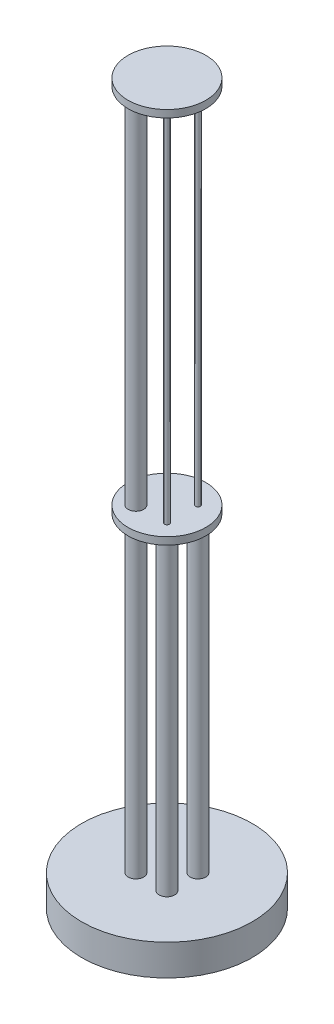
ISO-10303-21;
HEADER;
FILE_DESCRIPTION(('STEP AP214'),'2;1');
FILE_NAME('part.step','',(''),(''),'','','');
FILE_SCHEMA(('AUTOMOTIVE_DESIGN { 1 0 10303 214 1 1 1 1 }'));
ENDSEC;
DATA;
#1=APPLICATION_CONTEXT('core data for automotive mechanical design processes');
#2=APPLICATION_PROTOCOL_DEFINITION('international standard','automotive_design',2000,#1);
#3=PRODUCT_CONTEXT('',#1,'mechanical');
#4=PRODUCT('Part','Part','',(#3));
#5=PRODUCT_RELATED_PRODUCT_CATEGORY('part','',(#4));
#6=PRODUCT_DEFINITION_FORMATION('','',#4);
#7=PRODUCT_DEFINITION_CONTEXT('part definition',#1,'design');
#8=PRODUCT_DEFINITION('design','',#6,#7);
#9=PRODUCT_DEFINITION_SHAPE('','',#8);
#10=(LENGTH_UNIT() NAMED_UNIT(*) SI_UNIT(.MILLI.,.METRE.));
#11=(NAMED_UNIT(*) PLANE_ANGLE_UNIT() SI_UNIT($,.RADIAN.));
#12=(NAMED_UNIT(*) SI_UNIT($,.STERADIAN.) SOLID_ANGLE_UNIT());
#13=UNCERTAINTY_MEASURE_WITH_UNIT(LENGTH_MEASURE(1.E-05),#10,'distance_accuracy_value','');
#14=(GEOMETRIC_REPRESENTATION_CONTEXT(3) GLOBAL_UNCERTAINTY_ASSIGNED_CONTEXT((#13)) GLOBAL_UNIT_ASSIGNED_CONTEXT((#10,
#11,#12)) REPRESENTATION_CONTEXT('',''));
#15=CARTESIAN_POINT('',(0.,0.,0.));
#16=DIRECTION('',(0.,0.,1.));
#17=DIRECTION('',(1.,0.,0.));
#18=AXIS2_PLACEMENT_3D('',#15,#16,#17);
#19=CARTESIAN_POINT('',(6.35,297.428427124746,6.35));
#20=DIRECTION('',(0.,-1.,0.));
#21=DIRECTION('',(0.,0.,-1.));
#22=AXIS2_PLACEMENT_3D('',#19,#20,#21);
#23=CYLINDRICAL_SURFACE('',#22,1.);
#24=CARTESIAN_POINT('',(6.35,143.1,6.35));
#25=DIRECTION('',(0.,1.,0.));
#26=DIRECTION('',(0.,0.,1.));
#27=AXIS2_PLACEMENT_3D('',#24,#25,#26);
#28=CIRCLE('',#27,1.);
#29=CARTESIAN_POINT('',(6.35,143.1,7.35));
#30=VERTEX_POINT('',#29);
#31=EDGE_CURVE('E57',#30,#30,#28,.T.);
#32=ORIENTED_EDGE('',*,*,#31,.T.);
#33=EDGE_LOOP('',(#32));
#34=FACE_BOUND('',#33,.T.);
#35=CARTESIAN_POINT('',(6.35,291.6,6.35));
#36=DIRECTION('',(0.,1.,0.));
#37=DIRECTION('',(0.,0.,1.));
#38=AXIS2_PLACEMENT_3D('',#35,#36,#37);
#39=CIRCLE('',#38,1.);
#40=CARTESIAN_POINT('',(6.35,291.6,7.35));
#41=VERTEX_POINT('',#40);
#42=EDGE_CURVE('E10',#41,#41,#39,.T.);
#43=ORIENTED_EDGE('',*,*,#42,.F.);
#44=EDGE_LOOP('',(#43));
#45=FACE_BOUND('',#44,.T.);
#46=ADVANCED_FACE('F30',(#34,#45),#23,.T.);
#47=CARTESIAN_POINT('',(6.35,297.428427124746,-6.35));
#48=DIRECTION('',(0.,-1.,0.));
#49=DIRECTION('',(0.,0.,-1.));
#50=AXIS2_PLACEMENT_3D('',#47,#48,#49);
#51=CYLINDRICAL_SURFACE('',#50,1.);
#52=CARTESIAN_POINT('',(6.35,143.1,-6.35));
#53=DIRECTION('',(0.,-1.,0.));
#54=DIRECTION('',(0.,0.,-1.));
#55=AXIS2_PLACEMENT_3D('',#52,#53,#54);
#56=CIRCLE('',#55,1.);
#57=CARTESIAN_POINT('',(6.35,143.1,-7.35));
#58=VERTEX_POINT('',#57);
#59=EDGE_CURVE('E89',#58,#58,#56,.F.);
#60=ORIENTED_EDGE('',*,*,#59,.T.);
#61=EDGE_LOOP('',(#60));
#62=FACE_BOUND('',#61,.T.);
#63=CARTESIAN_POINT('',(6.35,291.6,-6.35));
#64=DIRECTION('',(0.,1.,0.));
#65=DIRECTION('',(0.,0.,1.));
#66=AXIS2_PLACEMENT_3D('',#63,#64,#65);
#67=CIRCLE('',#66,1.);
#68=CARTESIAN_POINT('',(6.35,291.6,-5.35));
#69=VERTEX_POINT('',#68);
#70=EDGE_CURVE('E38',#69,#69,#67,.T.);
#71=ORIENTED_EDGE('',*,*,#70,.F.);
#72=EDGE_LOOP('',(#71));
#73=FACE_BOUND('',#72,.T.);
#74=ADVANCED_FACE('F121',(#62,#73),#51,.T.);
#75=CARTESIAN_POINT('',(-6.35,297.428427124746,-6.35));
#76=DIRECTION('',(0.,-1.,0.));
#77=DIRECTION('',(0.,0.,-1.));
#78=AXIS2_PLACEMENT_3D('',#75,#76,#77);
#79=CYLINDRICAL_SURFACE('',#78,1.);
#80=CARTESIAN_POINT('',(-6.35,143.1,-6.35));
#81=DIRECTION('',(0.,1.,0.));
#82=DIRECTION('',(0.,0.,1.));
#83=AXIS2_PLACEMENT_3D('',#80,#81,#82);
#84=CIRCLE('',#83,1.);
#85=CARTESIAN_POINT('',(-6.35,143.1,-5.35));
#86=VERTEX_POINT('',#85);
#87=EDGE_CURVE('E70',#86,#86,#84,.T.);
#88=ORIENTED_EDGE('',*,*,#87,.T.);
#89=EDGE_LOOP('',(#88));
#90=FACE_BOUND('',#89,.T.);
#91=CARTESIAN_POINT('',(-6.35,291.6,-6.35));
#92=DIRECTION('',(0.,1.,0.));
#93=DIRECTION('',(0.,0.,1.));
#94=AXIS2_PLACEMENT_3D('',#91,#92,#93);
#95=CIRCLE('',#94,1.);
#96=CARTESIAN_POINT('',(-6.35,291.6,-5.35));
#97=VERTEX_POINT('',#96);
#98=EDGE_CURVE('E43',#97,#97,#95,.T.);
#99=ORIENTED_EDGE('',*,*,#98,.F.);
#100=EDGE_LOOP('',(#99));
#101=FACE_BOUND('',#100,.T.);
#102=ADVANCED_FACE('F118',(#90,#101),#79,.T.);
#103=CARTESIAN_POINT('',(-6.35,143.1,6.35));
#104=DIRECTION('',(0.,-1.,0.));
#105=DIRECTION('',(0.,0.,-1.));
#106=AXIS2_PLACEMENT_3D('',#103,#104,#105);
#107=CYLINDRICAL_SURFACE('',#106,3.175);
#108=CARTESIAN_POINT('',(-6.35,143.1,6.35));
#109=DIRECTION('',(0.,1.,0.));
#110=DIRECTION('',(0.,0.,1.));
#111=AXIS2_PLACEMENT_3D('',#108,#109,#110);
#112=CIRCLE('',#111,3.175);
#113=CARTESIAN_POINT('',(-6.35,143.1,9.525));
#114=VERTEX_POINT('',#113);
#115=EDGE_CURVE('E50',#114,#114,#112,.T.);
#116=ORIENTED_EDGE('',*,*,#115,.T.);
#117=EDGE_LOOP('',(#116));
#118=FACE_BOUND('',#117,.T.);
#119=CARTESIAN_POINT('',(-6.35,291.6,6.35));
#120=DIRECTION('',(0.,1.,0.));
#121=DIRECTION('',(0.,0.,1.));
#122=AXIS2_PLACEMENT_3D('',#119,#120,#121);
#123=CIRCLE('',#122,3.175);
#124=CARTESIAN_POINT('',(-6.35,291.6,9.525));
#125=VERTEX_POINT('',#124);
#126=EDGE_CURVE('E34',#125,#125,#123,.T.);
#127=ORIENTED_EDGE('',*,*,#126,.F.);
#128=EDGE_LOOP('',(#127));
#129=FACE_BOUND('',#128,.T.);
#130=ADVANCED_FACE('F105',(#118,#129),#107,.T.);
#131=CARTESIAN_POINT('',(-6.35,143.1,-6.35));
#132=DIRECTION('',(0.,-1.,0.));
#133=DIRECTION('',(0.,0.,-1.));
#134=AXIS2_PLACEMENT_3D('',#131,#132,#133);
#135=CYLINDRICAL_SURFACE('',#134,3.175);
#136=CARTESIAN_POINT('',(-6.35,12.7,-6.35));
#137=DIRECTION('',(0.,1.,0.));
#138=DIRECTION('',(0.,0.,1.));
#139=AXIS2_PLACEMENT_3D('',#136,#137,#138);
#140=CIRCLE('',#139,3.175);
#141=CARTESIAN_POINT('',(-6.35,12.7,-3.175));
#142=VERTEX_POINT('',#141);
#143=EDGE_CURVE('E82',#142,#142,#140,.T.);
#144=ORIENTED_EDGE('',*,*,#143,.T.);
#145=EDGE_LOOP('',(#144));
#146=FACE_BOUND('',#145,.T.);
#147=CARTESIAN_POINT('',(-6.35,140.1,-6.35));
#148=DIRECTION('',(0.,1.,0.));
#149=DIRECTION('',(0.,0.,1.));
#150=AXIS2_PLACEMENT_3D('',#147,#148,#149);
#151=CIRCLE('',#150,3.175);
#152=CARTESIAN_POINT('',(-6.35,140.1,-3.175));
#153=VERTEX_POINT('',#152);
#154=EDGE_CURVE('E65',#153,#153,#151,.T.);
#155=ORIENTED_EDGE('',*,*,#154,.F.);
#156=EDGE_LOOP('',(#155));
#157=FACE_BOUND('',#156,.T.);
#158=ADVANCED_FACE('F117',(#146,#157),#135,.T.);
#159=CARTESIAN_POINT('',(6.35,143.1,-6.35));
#160=DIRECTION('',(0.,-1.,0.));
#161=DIRECTION('',(0.,0.,-1.));
#162=AXIS2_PLACEMENT_3D('',#159,#160,#161);
#163=CYLINDRICAL_SURFACE('',#162,3.175);
#164=CARTESIAN_POINT('',(6.35,12.7,-6.35));
#165=DIRECTION('',(0.,1.,0.));
#166=DIRECTION('',(0.,0.,-1.));
#167=AXIS2_PLACEMENT_3D('',#164,#165,#166);
#168=CIRCLE('',#167,3.175);
#169=CARTESIAN_POINT('',(6.35,12.7,-9.525));
#170=VERTEX_POINT('',#169);
#171=EDGE_CURVE('E79',#170,#170,#168,.T.);
#172=ORIENTED_EDGE('',*,*,#171,.T.);
#173=EDGE_LOOP('',(#172));
#174=FACE_BOUND('',#173,.T.);
#175=CARTESIAN_POINT('',(6.35,140.1,-6.35));
#176=DIRECTION('',(0.,1.,0.));
#177=DIRECTION('',(0.,0.,1.));
#178=AXIS2_PLACEMENT_3D('',#175,#176,#177);
#179=CIRCLE('',#178,3.175);
#180=CARTESIAN_POINT('',(6.35,140.1,-3.175));
#181=VERTEX_POINT('',#180);
#182=EDGE_CURVE('E61',#181,#181,#179,.T.);
#183=ORIENTED_EDGE('',*,*,#182,.F.);
#184=EDGE_LOOP('',(#183));
#185=FACE_BOUND('',#184,.T.);
#186=ADVANCED_FACE('F112',(#174,#185),#163,.T.);
#187=CARTESIAN_POINT('',(6.35,143.1,6.35));
#188=DIRECTION('',(0.,-1.,0.));
#189=DIRECTION('',(0.,0.,-1.));
#190=AXIS2_PLACEMENT_3D('',#187,#188,#189);
#191=CYLINDRICAL_SURFACE('',#190,3.175);
#192=CARTESIAN_POINT('',(6.35,12.7,6.35));
#193=DIRECTION('',(0.,1.,0.));
#194=DIRECTION('',(0.,0.,1.));
#195=AXIS2_PLACEMENT_3D('',#192,#193,#194);
#196=CIRCLE('',#195,3.175);
#197=CARTESIAN_POINT('',(6.35,12.7,9.525));
#198=VERTEX_POINT('',#197);
#199=EDGE_CURVE('E76',#198,#198,#196,.T.);
#200=ORIENTED_EDGE('',*,*,#199,.T.);
#201=EDGE_LOOP('',(#200));
#202=FACE_BOUND('',#201,.T.);
#203=CARTESIAN_POINT('',(6.35,140.1,6.35));
#204=DIRECTION('',(0.,1.,0.));
#205=DIRECTION('',(0.,0.,1.));
#206=AXIS2_PLACEMENT_3D('',#203,#204,#205);
#207=CIRCLE('',#206,3.175);
#208=CARTESIAN_POINT('',(6.35,140.1,9.525));
#209=VERTEX_POINT('',#208);
#210=EDGE_CURVE('E58',#209,#209,#207,.T.);
#211=ORIENTED_EDGE('',*,*,#210,.F.);
#212=EDGE_LOOP('',(#211));
#213=FACE_BOUND('',#212,.T.);
#214=ADVANCED_FACE('F102',(#202,#213),#191,.T.);
#215=CARTESIAN_POINT('',(-6.35,12.7,6.35));
#216=DIRECTION('',(0.,1.,0.));
#217=DIRECTION('',(0.,0.,-1.));
#218=AXIS2_PLACEMENT_3D('',#215,#216,#217);
#219=CIRCLE('',#218,3.175);
#220=CARTESIAN_POINT('',(-6.35,12.7,3.175));
#221=VERTEX_POINT('',#220);
#222=EDGE_CURVE('E73',#221,#221,#219,.T.);
#223=ORIENTED_EDGE('',*,*,#222,.T.);
#224=EDGE_LOOP('',(#223));
#225=FACE_BOUND('',#224,.T.);
#226=CARTESIAN_POINT('',(-6.35,140.1,6.35));
#227=DIRECTION('',(0.,1.,0.));
#228=DIRECTION('',(0.,0.,1.));
#229=AXIS2_PLACEMENT_3D('',#226,#227,#228);
#230=CIRCLE('',#229,3.175);
#231=CARTESIAN_POINT('',(-6.35,140.1,9.525));
#232=VERTEX_POINT('',#231);
#233=EDGE_CURVE('E62',#232,#232,#230,.T.);
#234=ORIENTED_EDGE('',*,*,#233,.F.);
#235=EDGE_LOOP('',(#234));
#236=FACE_BOUND('',#235,.T.);
#237=ADVANCED_FACE('F99',(#225,#236),#107,.T.);
#238=CARTESIAN_POINT('',(0.,12.7,0.));
#239=DIRECTION('',(0.,1.,0.));
#240=DIRECTION('',(0.,0.,1.));
#241=AXIS2_PLACEMENT_3D('',#238,#239,#240);
#242=PLANE('',#241);
#243=ORIENTED_EDGE('',*,*,#199,.F.);
#244=EDGE_LOOP('',(#243));
#245=FACE_BOUND('',#244,.T.);
#246=ORIENTED_EDGE('',*,*,#143,.F.);
#247=EDGE_LOOP('',(#246));
#248=FACE_BOUND('',#247,.T.);
#249=CARTESIAN_POINT('',(0.,12.7,0.));
#250=DIRECTION('',(0.,1.,0.));
#251=DIRECTION('',(0.,0.,1.));
#252=AXIS2_PLACEMENT_3D('',#249,#250,#251);
#253=CIRCLE('',#252,34.925);
#254=CARTESIAN_POINT('',(0.,12.7,34.925));
#255=VERTEX_POINT('',#254);
#256=EDGE_CURVE('E86',#255,#255,#253,.T.);
#257=ORIENTED_EDGE('',*,*,#256,.T.);
#258=EDGE_LOOP('',(#257));
#259=FACE_BOUND('',#258,.T.);
#260=ORIENTED_EDGE('',*,*,#171,.F.);
#261=EDGE_LOOP('',(#260));
#262=FACE_BOUND('',#261,.T.);
#263=ORIENTED_EDGE('',*,*,#222,.F.);
#264=EDGE_LOOP('',(#263));
#265=FACE_BOUND('',#264,.T.);
#266=ADVANCED_FACE('F101',(#245,#248,#259,#262,#265),#242,.T.);
#267=CARTESIAN_POINT('',(0.,12.7,0.));
#268=DIRECTION('',(0.,-1.,0.));
#269=DIRECTION('',(0.,0.,-1.));
#270=AXIS2_PLACEMENT_3D('',#267,#268,#269);
#271=CYLINDRICAL_SURFACE('',#270,34.925);
#272=ORIENTED_EDGE('',*,*,#256,.F.);
#273=EDGE_LOOP('',(#272));
#274=FACE_BOUND('',#273,.T.);
#275=CARTESIAN_POINT('',(0.,0.,0.));
#276=DIRECTION('',(0.,1.,0.));
#277=DIRECTION('',(0.,0.,1.));
#278=AXIS2_PLACEMENT_3D('',#275,#276,#277);
#279=CIRCLE('',#278,34.925);
#280=CARTESIAN_POINT('',(0.,0.,34.925));
#281=VERTEX_POINT('',#280);
#282=EDGE_CURVE('E85',#281,#281,#279,.T.);
#283=ORIENTED_EDGE('',*,*,#282,.T.);
#284=EDGE_LOOP('',(#283));
#285=FACE_BOUND('',#284,.T.);
#286=ADVANCED_FACE('F32',(#274,#285),#271,.T.);
#287=CARTESIAN_POINT('',(0.,0.,0.));
#288=DIRECTION('',(0.,1.,0.));
#289=DIRECTION('',(0.,0.,1.));
#290=AXIS2_PLACEMENT_3D('',#287,#288,#289);
#291=PLANE('',#290);
#292=ORIENTED_EDGE('',*,*,#282,.F.);
#293=EDGE_LOOP('',(#292));
#294=FACE_BOUND('',#293,.T.);
#295=ADVANCED_FACE('F172',(#294),#291,.F.);
#296=CARTESIAN_POINT('',(0.,140.1,0.));
#297=DIRECTION('',(0.,1.,0.));
#298=DIRECTION('',(0.,0.,1.));
#299=AXIS2_PLACEMENT_3D('',#296,#297,#298);
#300=PLANE('',#299);
#301=ORIENTED_EDGE('',*,*,#182,.T.);
#302=EDGE_LOOP('',(#301));
#303=FACE_BOUND('',#302,.T.);
#304=ORIENTED_EDGE('',*,*,#233,.T.);
#305=EDGE_LOOP('',(#304));
#306=FACE_BOUND('',#305,.T.);
#307=CARTESIAN_POINT('',(0.,140.1,0.));
#308=DIRECTION('',(0.,1.,0.));
#309=DIRECTION('',(0.,0.,1.));
#310=AXIS2_PLACEMENT_3D('',#307,#308,#309);
#311=CIRCLE('',#310,15.9414428143557);
#312=CARTESIAN_POINT('',(0.,140.1,15.9414428143557));
#313=VERTEX_POINT('',#312);
#314=EDGE_CURVE('E47',#313,#313,#311,.T.);
#315=ORIENTED_EDGE('',*,*,#314,.F.);
#316=EDGE_LOOP('',(#315));
#317=FACE_BOUND('',#316,.T.);
#318=ORIENTED_EDGE('',*,*,#210,.T.);
#319=EDGE_LOOP('',(#318));
#320=FACE_BOUND('',#319,.T.);
#321=ORIENTED_EDGE('',*,*,#154,.T.);
#322=EDGE_LOOP('',(#321));
#323=FACE_BOUND('',#322,.T.);
#324=ADVANCED_FACE('F96',(#303,#306,#317,#320,#323),#300,.F.);
#325=CARTESIAN_POINT('',(0.,140.1,0.));
#326=DIRECTION('',(0.,1.,0.));
#327=DIRECTION('',(0.,0.,1.));
#328=AXIS2_PLACEMENT_3D('',#325,#326,#327);
#329=CYLINDRICAL_SURFACE('',#328,15.9414428143557);
#330=ORIENTED_EDGE('',*,*,#314,.T.);
#331=EDGE_LOOP('',(#330));
#332=FACE_BOUND('',#331,.T.);
#333=CARTESIAN_POINT('',(0.,143.1,0.));
#334=DIRECTION('',(0.,1.,0.));
#335=DIRECTION('',(0.,0.,1.));
#336=AXIS2_PLACEMENT_3D('',#333,#334,#335);
#337=CIRCLE('',#336,15.9414428143557);
#338=CARTESIAN_POINT('',(0.,143.1,15.9414428143557));
#339=VERTEX_POINT('',#338);
#340=EDGE_CURVE('E51',#339,#339,#337,.T.);
#341=ORIENTED_EDGE('',*,*,#340,.F.);
#342=EDGE_LOOP('',(#341));
#343=FACE_BOUND('',#342,.T.);
#344=ADVANCED_FACE('F131',(#332,#343),#329,.T.);
#345=CARTESIAN_POINT('',(-6.35,143.1,-6.35));
#346=DIRECTION('',(0.,1.,0.));
#347=DIRECTION('',(0.,0.,1.));
#348=AXIS2_PLACEMENT_3D('',#345,#346,#347);
#349=PLANE('',#348);
#350=ORIENTED_EDGE('',*,*,#87,.F.);
#351=EDGE_LOOP('',(#350));
#352=FACE_BOUND('',#351,.T.);
#353=ORIENTED_EDGE('',*,*,#59,.F.);
#354=EDGE_LOOP('',(#353));
#355=FACE_BOUND('',#354,.T.);
#356=ORIENTED_EDGE('',*,*,#31,.F.);
#357=EDGE_LOOP('',(#356));
#358=FACE_BOUND('',#357,.T.);
#359=ORIENTED_EDGE('',*,*,#115,.F.);
#360=EDGE_LOOP('',(#359));
#361=FACE_BOUND('',#360,.T.);
#362=ORIENTED_EDGE('',*,*,#340,.T.);
#363=EDGE_LOOP('',(#362));
#364=FACE_BOUND('',#363,.T.);
#365=ADVANCED_FACE('F162',(#352,#355,#358,#361,#364),#349,.T.);
#366=CARTESIAN_POINT('',(0.,291.6,0.));
#367=DIRECTION('',(0.,1.,0.));
#368=DIRECTION('',(0.,0.,1.));
#369=AXIS2_PLACEMENT_3D('',#366,#367,#368);
#370=PLANE('',#369);
#371=ORIENTED_EDGE('',*,*,#70,.T.);
#372=EDGE_LOOP('',(#371));
#373=FACE_BOUND('',#372,.T.);
#374=ORIENTED_EDGE('',*,*,#126,.T.);
#375=EDGE_LOOP('',(#374));
#376=FACE_BOUND('',#375,.T.);
#377=CARTESIAN_POINT('',(0.,291.6,0.));
#378=DIRECTION('',(0.,1.,0.));
#379=DIRECTION('',(0.,0.,1.));
#380=AXIS2_PLACEMENT_3D('',#377,#378,#379);
#381=CIRCLE('',#380,15.9414428143557);
#382=CARTESIAN_POINT('',(0.,291.6,15.9414428143557));
#383=VERTEX_POINT('',#382);
#384=EDGE_CURVE('E54',#383,#383,#381,.T.);
#385=ORIENTED_EDGE('',*,*,#384,.F.);
#386=EDGE_LOOP('',(#385));
#387=FACE_BOUND('',#386,.T.);
#388=ORIENTED_EDGE('',*,*,#98,.T.);
#389=EDGE_LOOP('',(#388));
#390=FACE_BOUND('',#389,.T.);
#391=ORIENTED_EDGE('',*,*,#42,.T.);
#392=EDGE_LOOP('',(#391));
#393=FACE_BOUND('',#392,.T.);
#394=ADVANCED_FACE('F143',(#373,#376,#387,#390,#393),#370,.F.);
#395=CARTESIAN_POINT('',(0.,291.6,0.));
#396=DIRECTION('',(0.,1.,0.));
#397=DIRECTION('',(0.,0.,1.));
#398=AXIS2_PLACEMENT_3D('',#395,#396,#397);
#399=CYLINDRICAL_SURFACE('',#398,15.9414428143557);
#400=ORIENTED_EDGE('',*,*,#384,.T.);
#401=EDGE_LOOP('',(#400));
#402=FACE_BOUND('',#401,.T.);
#403=CARTESIAN_POINT('',(0.,294.6,0.));
#404=DIRECTION('',(0.,1.,0.));
#405=DIRECTION('',(0.,0.,1.));
#406=AXIS2_PLACEMENT_3D('',#403,#404,#405);
#407=CIRCLE('',#406,15.9414428143557);
#408=CARTESIAN_POINT('',(0.,294.6,15.9414428143557));
#409=VERTEX_POINT('',#408);
#410=EDGE_CURVE('E148',#409,#409,#407,.T.);
#411=ORIENTED_EDGE('',*,*,#410,.F.);
#412=EDGE_LOOP('',(#411));
#413=FACE_BOUND('',#412,.T.);
#414=ADVANCED_FACE('F138',(#402,#413),#399,.T.);
#415=CARTESIAN_POINT('',(-6.35,294.6,6.35));
#416=DIRECTION('',(0.,1.,0.));
#417=DIRECTION('',(0.,0.,1.));
#418=AXIS2_PLACEMENT_3D('',#415,#416,#417);
#419=PLANE('',#418);
#420=ORIENTED_EDGE('',*,*,#410,.T.);
#421=EDGE_LOOP('',(#420));
#422=FACE_BOUND('',#421,.T.);
#423=ADVANCED_FACE('F136',(#422),#419,.T.);
#424=CLOSED_SHELL('',(#46,#74,#102,#130,#158,#186,#214,#237,#266,#286,#295,#324,#344,#365,#394,
#414,#423));
#425=MANIFOLD_SOLID_BREP('B2',#424);
#426=ADVANCED_BREP_SHAPE_REPRESENTATION('',(#18,#425),#14);
#427=SHAPE_DEFINITION_REPRESENTATION(#9,#426);
ENDSEC;
END-ISO-10303-21;
